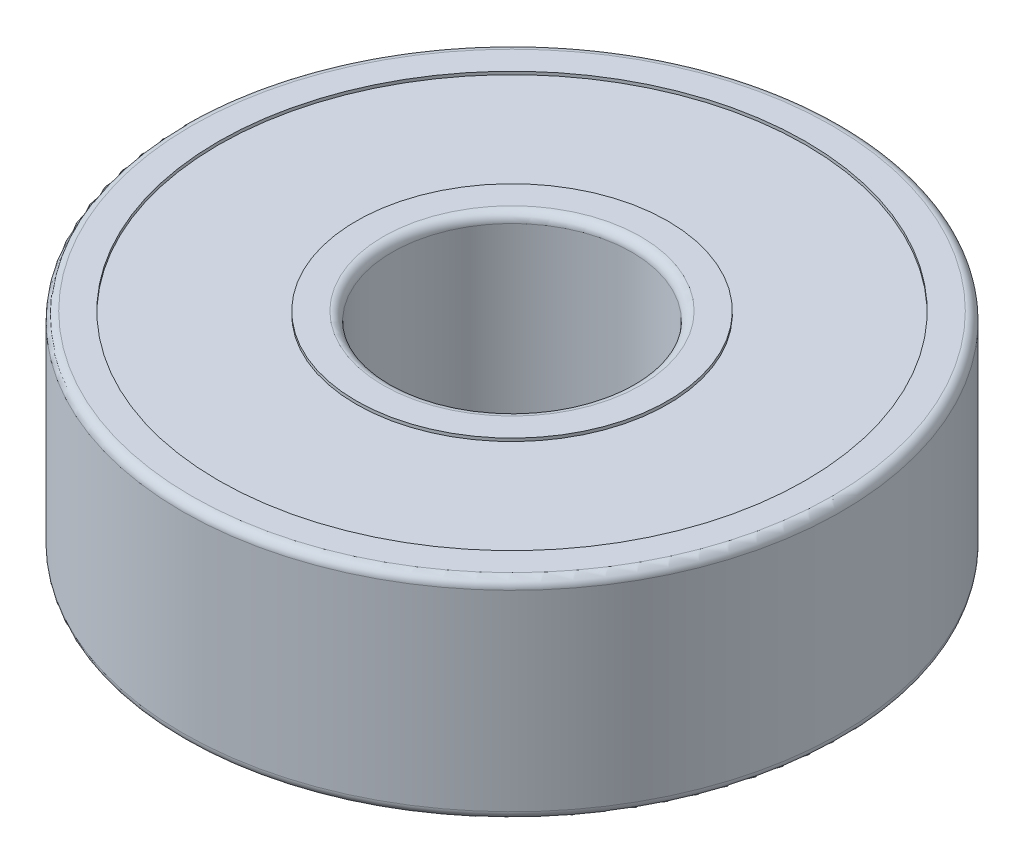
ISO-10303-21;
HEADER;
FILE_DESCRIPTION(('STEP AP214'),'2;1');
FILE_NAME('part.step','',(''),(''),'','','');
FILE_SCHEMA(('AUTOMOTIVE_DESIGN { 1 0 10303 214 1 1 1 1 }'));
ENDSEC;
DATA;
#1=APPLICATION_CONTEXT('core data for automotive mechanical design processes');
#2=APPLICATION_PROTOCOL_DEFINITION('international standard','automotive_design',2000,#1);
#3=PRODUCT_CONTEXT('',#1,'mechanical');
#4=PRODUCT('Part','Part','',(#3));
#5=PRODUCT_RELATED_PRODUCT_CATEGORY('part','',(#4));
#6=PRODUCT_DEFINITION_FORMATION('','',#4);
#7=PRODUCT_DEFINITION_CONTEXT('part definition',#1,'design');
#8=PRODUCT_DEFINITION('design','',#6,#7);
#9=PRODUCT_DEFINITION_SHAPE('','',#8);
#10=(LENGTH_UNIT() NAMED_UNIT(*) SI_UNIT(.MILLI.,.METRE.));
#11=(NAMED_UNIT(*) PLANE_ANGLE_UNIT() SI_UNIT($,.RADIAN.));
#12=(NAMED_UNIT(*) SI_UNIT($,.STERADIAN.) SOLID_ANGLE_UNIT());
#13=UNCERTAINTY_MEASURE_WITH_UNIT(LENGTH_MEASURE(1.E-05),#10,'distance_accuracy_value','');
#14=(GEOMETRIC_REPRESENTATION_CONTEXT(3) GLOBAL_UNCERTAINTY_ASSIGNED_CONTEXT((#13)) GLOBAL_UNIT_ASSIGNED_CONTEXT((#10,
#11,#12)) REPRESENTATION_CONTEXT('',''));
#15=CARTESIAN_POINT('',(0.,0.,0.));
#16=DIRECTION('',(0.,0.,1.));
#17=DIRECTION('',(1.,0.,0.));
#18=AXIS2_PLACEMENT_3D('',#15,#16,#17);
#19=CARTESIAN_POINT('',(0.,0.,0.));
#20=DIRECTION('',(0.,1.,0.));
#21=DIRECTION('',(0.,0.,1.));
#22=AXIS2_PLACEMENT_3D('',#19,#20,#21);
#23=PLANE('',#22);
#24=CARTESIAN_POINT('',(0.,0.,0.));
#25=DIRECTION('',(0.,1.,0.));
#26=DIRECTION('',(0.,0.,1.));
#27=AXIS2_PLACEMENT_3D('',#24,#25,#26);
#28=CIRCLE('',#27,4.3);
#29=CARTESIAN_POINT('',(0.,0.,4.3));
#30=VERTEX_POINT('',#29);
#31=EDGE_CURVE('E57',#30,#30,#28,.T.);
#32=ORIENTED_EDGE('',*,*,#31,.T.);
#33=EDGE_LOOP('',(#32));
#34=FACE_BOUND('',#33,.T.);
#35=CARTESIAN_POINT('',(0.,0.,0.));
#36=DIRECTION('',(0.,1.,0.));
#37=DIRECTION('',(0.,0.,1.));
#38=AXIS2_PLACEMENT_3D('',#35,#36,#37);
#39=CIRCLE('',#38,5.2);
#40=CARTESIAN_POINT('',(0.,0.,5.2));
#41=VERTEX_POINT('',#40);
#42=EDGE_CURVE('E88',#41,#41,#39,.T.);
#43=ORIENTED_EDGE('',*,*,#42,.F.);
#44=EDGE_LOOP('',(#43));
#45=FACE_BOUND('',#44,.T.);
#46=ADVANCED_FACE('F37',(#34,#45),#23,.F.);
#47=CARTESIAN_POINT('',(0.,7.,0.));
#48=DIRECTION('',(0.,1.,0.));
#49=DIRECTION('',(0.,0.,1.));
#50=AXIS2_PLACEMENT_3D('',#47,#48,#49);
#51=PLANE('',#50);
#52=CARTESIAN_POINT('',(0.,7.,0.));
#53=DIRECTION('',(0.,1.,0.));
#54=DIRECTION('',(0.,0.,1.));
#55=AXIS2_PLACEMENT_3D('',#52,#53,#54);
#56=CIRCLE('',#55,4.3);
#57=CARTESIAN_POINT('',(0.,7.,4.3));
#58=VERTEX_POINT('',#57);
#59=EDGE_CURVE('E60',#58,#58,#56,.F.);
#60=ORIENTED_EDGE('',*,*,#59,.T.);
#61=EDGE_LOOP('',(#60));
#62=FACE_BOUND('',#61,.T.);
#63=CARTESIAN_POINT('',(0.,7.,0.));
#64=DIRECTION('',(0.,1.,0.));
#65=DIRECTION('',(0.,0.,1.));
#66=AXIS2_PLACEMENT_3D('',#63,#64,#65);
#67=CIRCLE('',#66,5.2);
#68=CARTESIAN_POINT('',(0.,7.,5.2));
#69=VERTEX_POINT('',#68);
#70=EDGE_CURVE('E76',#69,#69,#67,.T.);
#71=ORIENTED_EDGE('',*,*,#70,.T.);
#72=EDGE_LOOP('',(#71));
#73=FACE_BOUND('',#72,.T.);
#74=ADVANCED_FACE('F105',(#62,#73),#51,.T.);
#75=CARTESIAN_POINT('',(0.,7.,0.));
#76=DIRECTION('',(0.,1.,0.));
#77=DIRECTION('',(0.,0.,1.));
#78=AXIS2_PLACEMENT_3D('',#75,#76,#77);
#79=CIRCLE('',#78,10.7);
#80=CARTESIAN_POINT('',(0.,7.,10.7));
#81=VERTEX_POINT('',#80);
#82=EDGE_CURVE('E10',#81,#81,#79,.T.);
#83=ORIENTED_EDGE('',*,*,#82,.T.);
#84=EDGE_LOOP('',(#83));
#85=FACE_BOUND('',#84,.T.);
#86=CARTESIAN_POINT('',(0.,7.,0.));
#87=DIRECTION('',(0.,1.,0.));
#88=DIRECTION('',(0.,0.,1.));
#89=AXIS2_PLACEMENT_3D('',#86,#87,#88);
#90=CIRCLE('',#89,9.8);
#91=CARTESIAN_POINT('',(0.,7.,9.8));
#92=VERTEX_POINT('',#91);
#93=EDGE_CURVE('E70',#92,#92,#90,.T.);
#94=ORIENTED_EDGE('',*,*,#93,.F.);
#95=EDGE_LOOP('',(#94));
#96=FACE_BOUND('',#95,.T.);
#97=ADVANCED_FACE('F112',(#85,#96),#51,.T.);
#98=CARTESIAN_POINT('',(0.,0.,0.));
#99=DIRECTION('',(0.,1.,0.));
#100=DIRECTION('',(0.,0.,1.));
#101=AXIS2_PLACEMENT_3D('',#98,#99,#100);
#102=CIRCLE('',#101,10.7);
#103=CARTESIAN_POINT('',(0.,0.,10.7));
#104=VERTEX_POINT('',#103);
#105=EDGE_CURVE('E44',#104,#104,#102,.F.);
#106=ORIENTED_EDGE('',*,*,#105,.T.);
#107=EDGE_LOOP('',(#106));
#108=FACE_BOUND('',#107,.T.);
#109=CARTESIAN_POINT('',(0.,0.,0.));
#110=DIRECTION('',(0.,1.,0.));
#111=DIRECTION('',(0.,0.,1.));
#112=AXIS2_PLACEMENT_3D('',#109,#110,#111);
#113=CIRCLE('',#112,9.8);
#114=CARTESIAN_POINT('',(0.,0.,9.8));
#115=VERTEX_POINT('',#114);
#116=EDGE_CURVE('E82',#115,#115,#113,.T.);
#117=ORIENTED_EDGE('',*,*,#116,.T.);
#118=EDGE_LOOP('',(#117));
#119=FACE_BOUND('',#118,.T.);
#120=ADVANCED_FACE('F108',(#108,#119),#23,.F.);
#121=CARTESIAN_POINT('',(0.,7.,0.));
#122=DIRECTION('',(0.,-1.,0.));
#123=DIRECTION('',(0.,0.,-1.));
#124=AXIS2_PLACEMENT_3D('',#121,#122,#123);
#125=CYLINDRICAL_SURFACE('',#124,11.);
#126=CARTESIAN_POINT('',(0.,0.3,0.));
#127=DIRECTION('',(0.,1.,0.));
#128=DIRECTION('',(0.,0.,1.));
#129=AXIS2_PLACEMENT_3D('',#126,#127,#128);
#130=CIRCLE('',#129,11.);
#131=CARTESIAN_POINT('',(0.,0.3,11.));
#132=VERTEX_POINT('',#131);
#133=EDGE_CURVE('E48',#132,#132,#130,.T.);
#134=ORIENTED_EDGE('',*,*,#133,.T.);
#135=EDGE_LOOP('',(#134));
#136=FACE_BOUND('',#135,.T.);
#137=CARTESIAN_POINT('',(0.,6.7,0.));
#138=DIRECTION('',(0.,1.,0.));
#139=DIRECTION('',(0.,0.,1.));
#140=AXIS2_PLACEMENT_3D('',#137,#138,#139);
#141=CIRCLE('',#140,11.);
#142=CARTESIAN_POINT('',(0.,6.7,11.));
#143=VERTEX_POINT('',#142);
#144=EDGE_CURVE('E52',#143,#143,#141,.F.);
#145=ORIENTED_EDGE('',*,*,#144,.T.);
#146=EDGE_LOOP('',(#145));
#147=FACE_BOUND('',#146,.T.);
#148=ADVANCED_FACE('F117',(#136,#147),#125,.T.);
#149=CARTESIAN_POINT('',(0.,7.,0.));
#150=DIRECTION('',(0.,-1.,0.));
#151=DIRECTION('',(0.,0.,-1.));
#152=AXIS2_PLACEMENT_3D('',#149,#150,#151);
#153=CYLINDRICAL_SURFACE('',#152,4.);
#154=CARTESIAN_POINT('',(0.,6.7,0.));
#155=DIRECTION('',(0.,1.,0.));
#156=DIRECTION('',(0.,0.,1.));
#157=AXIS2_PLACEMENT_3D('',#154,#155,#156);
#158=CIRCLE('',#157,4.);
#159=CARTESIAN_POINT('',(0.,6.7,4.));
#160=VERTEX_POINT('',#159);
#161=EDGE_CURVE('E63',#160,#160,#158,.T.);
#162=ORIENTED_EDGE('',*,*,#161,.T.);
#163=EDGE_LOOP('',(#162));
#164=FACE_BOUND('',#163,.T.);
#165=CARTESIAN_POINT('',(0.,0.3,0.));
#166=DIRECTION('',(0.,1.,0.));
#167=DIRECTION('',(0.,0.,1.));
#168=AXIS2_PLACEMENT_3D('',#165,#166,#167);
#169=CIRCLE('',#168,4.);
#170=CARTESIAN_POINT('',(0.,0.3,4.));
#171=VERTEX_POINT('',#170);
#172=EDGE_CURVE('E66',#171,#171,#169,.F.);
#173=ORIENTED_EDGE('',*,*,#172,.T.);
#174=EDGE_LOOP('',(#173));
#175=FACE_BOUND('',#174,.T.);
#176=ADVANCED_FACE('F122',(#164,#175),#153,.F.);
#177=CARTESIAN_POINT('',(0.,6.9,0.));
#178=DIRECTION('',(0.,1.,0.));
#179=DIRECTION('',(0.,0.,1.));
#180=AXIS2_PLACEMENT_3D('',#177,#178,#179);
#181=CYLINDRICAL_SURFACE('',#180,9.8);
#182=CARTESIAN_POINT('',(0.,6.9,0.));
#183=DIRECTION('',(0.,1.,0.));
#184=DIRECTION('',(0.,0.,1.));
#185=AXIS2_PLACEMENT_3D('',#182,#183,#184);
#186=CIRCLE('',#185,9.8);
#187=CARTESIAN_POINT('',(0.,6.9,9.8));
#188=VERTEX_POINT('',#187);
#189=EDGE_CURVE('E69',#188,#188,#186,.T.);
#190=ORIENTED_EDGE('',*,*,#189,.F.);
#191=EDGE_LOOP('',(#190));
#192=FACE_BOUND('',#191,.T.);
#193=ORIENTED_EDGE('',*,*,#93,.T.);
#194=EDGE_LOOP('',(#193));
#195=FACE_BOUND('',#194,.T.);
#196=ADVANCED_FACE('F143',(#192,#195),#181,.F.);
#197=CARTESIAN_POINT('',(0.,6.9,0.));
#198=DIRECTION('',(0.,1.,0.));
#199=DIRECTION('',(0.,0.,1.));
#200=AXIS2_PLACEMENT_3D('',#197,#198,#199);
#201=PLANE('',#200);
#202=CARTESIAN_POINT('',(0.,6.9,0.));
#203=DIRECTION('',(0.,1.,0.));
#204=DIRECTION('',(0.,0.,1.));
#205=AXIS2_PLACEMENT_3D('',#202,#203,#204);
#206=CIRCLE('',#205,5.2);
#207=CARTESIAN_POINT('',(0.,6.9,5.2));
#208=VERTEX_POINT('',#207);
#209=EDGE_CURVE('E73',#208,#208,#206,.T.);
#210=ORIENTED_EDGE('',*,*,#209,.F.);
#211=EDGE_LOOP('',(#210));
#212=FACE_BOUND('',#211,.T.);
#213=ORIENTED_EDGE('',*,*,#189,.T.);
#214=EDGE_LOOP('',(#213));
#215=FACE_BOUND('',#214,.T.);
#216=ADVANCED_FACE('F139',(#212,#215),#201,.T.);
#217=CARTESIAN_POINT('',(0.,6.9,0.));
#218=DIRECTION('',(0.,1.,0.));
#219=DIRECTION('',(0.,0.,1.));
#220=AXIS2_PLACEMENT_3D('',#217,#218,#219);
#221=CYLINDRICAL_SURFACE('',#220,5.2);
#222=ORIENTED_EDGE('',*,*,#209,.T.);
#223=EDGE_LOOP('',(#222));
#224=FACE_BOUND('',#223,.T.);
#225=ORIENTED_EDGE('',*,*,#70,.F.);
#226=EDGE_LOOP('',(#225));
#227=FACE_BOUND('',#226,.T.);
#228=ADVANCED_FACE('F133',(#224,#227),#221,.T.);
#229=CARTESIAN_POINT('',(0.,0.1,0.));
#230=DIRECTION('',(0.,-1.,0.));
#231=DIRECTION('',(0.,0.,1.));
#232=AXIS2_PLACEMENT_3D('',#229,#230,#231);
#233=PLANE('',#232);
#234=CARTESIAN_POINT('',(0.,0.1,0.));
#235=DIRECTION('',(0.,1.,0.));
#236=DIRECTION('',(0.,0.,1.));
#237=AXIS2_PLACEMENT_3D('',#234,#235,#236);
#238=CIRCLE('',#237,9.8);
#239=CARTESIAN_POINT('',(0.,0.1,9.8));
#240=VERTEX_POINT('',#239);
#241=EDGE_CURVE('E79',#240,#240,#238,.T.);
#242=ORIENTED_EDGE('',*,*,#241,.F.);
#243=EDGE_LOOP('',(#242));
#244=FACE_BOUND('',#243,.T.);
#245=CARTESIAN_POINT('',(0.,0.1,0.));
#246=DIRECTION('',(0.,1.,0.));
#247=DIRECTION('',(0.,0.,1.));
#248=AXIS2_PLACEMENT_3D('',#245,#246,#247);
#249=CIRCLE('',#248,5.2);
#250=CARTESIAN_POINT('',(0.,0.1,5.2));
#251=VERTEX_POINT('',#250);
#252=EDGE_CURVE('E85',#251,#251,#249,.T.);
#253=ORIENTED_EDGE('',*,*,#252,.T.);
#254=EDGE_LOOP('',(#253));
#255=FACE_BOUND('',#254,.T.);
#256=ADVANCED_FACE('F94',(#244,#255),#233,.T.);
#257=CARTESIAN_POINT('',(0.,0.1,0.));
#258=DIRECTION('',(0.,-1.,0.));
#259=DIRECTION('',(0.,0.,-1.));
#260=AXIS2_PLACEMENT_3D('',#257,#258,#259);
#261=CYLINDRICAL_SURFACE('',#260,9.8);
#262=ORIENTED_EDGE('',*,*,#241,.T.);
#263=EDGE_LOOP('',(#262));
#264=FACE_BOUND('',#263,.T.);
#265=ORIENTED_EDGE('',*,*,#116,.F.);
#266=EDGE_LOOP('',(#265));
#267=FACE_BOUND('',#266,.T.);
#268=ADVANCED_FACE('F100',(#264,#267),#261,.F.);
#269=CARTESIAN_POINT('',(0.,0.1,0.));
#270=DIRECTION('',(0.,-1.,0.));
#271=DIRECTION('',(0.,0.,-1.));
#272=AXIS2_PLACEMENT_3D('',#269,#270,#271);
#273=CYLINDRICAL_SURFACE('',#272,5.2);
#274=ORIENTED_EDGE('',*,*,#252,.F.);
#275=EDGE_LOOP('',(#274));
#276=FACE_BOUND('',#275,.T.);
#277=ORIENTED_EDGE('',*,*,#42,.T.);
#278=EDGE_LOOP('',(#277));
#279=FACE_BOUND('',#278,.T.);
#280=ADVANCED_FACE('F96',(#276,#279),#273,.T.);
#281=CARTESIAN_POINT('',(0.,6.7,0.));
#282=DIRECTION('',(0.,1.,0.));
#283=DIRECTION('',(0.,0.,1.));
#284=AXIS2_PLACEMENT_3D('',#281,#282,#283);
#285=TOROIDAL_SURFACE('',#284,4.3,0.3);
#286=ORIENTED_EDGE('',*,*,#59,.F.);
#287=EDGE_LOOP('',(#286));
#288=FACE_BOUND('',#287,.T.);
#289=ORIENTED_EDGE('',*,*,#161,.F.);
#290=EDGE_LOOP('',(#289));
#291=FACE_BOUND('',#290,.T.);
#292=ADVANCED_FACE('F99',(#288,#291),#285,.T.);
#293=CARTESIAN_POINT('',(0.,0.3,0.));
#294=DIRECTION('',(0.,1.,0.));
#295=DIRECTION('',(0.,0.,1.));
#296=AXIS2_PLACEMENT_3D('',#293,#294,#295);
#297=TOROIDAL_SURFACE('',#296,4.3,0.3);
#298=ORIENTED_EDGE('',*,*,#172,.F.);
#299=EDGE_LOOP('',(#298));
#300=FACE_BOUND('',#299,.T.);
#301=ORIENTED_EDGE('',*,*,#31,.F.);
#302=EDGE_LOOP('',(#301));
#303=FACE_BOUND('',#302,.T.);
#304=ADVANCED_FACE('F156',(#300,#303),#297,.T.);
#305=CARTESIAN_POINT('',(0.,0.3,0.));
#306=DIRECTION('',(0.,1.,0.));
#307=DIRECTION('',(0.,0.,1.));
#308=AXIS2_PLACEMENT_3D('',#305,#306,#307);
#309=TOROIDAL_SURFACE('',#308,10.7,0.3);
#310=ORIENTED_EDGE('',*,*,#105,.F.);
#311=EDGE_LOOP('',(#310));
#312=FACE_BOUND('',#311,.T.);
#313=ORIENTED_EDGE('',*,*,#133,.F.);
#314=EDGE_LOOP('',(#313));
#315=FACE_BOUND('',#314,.T.);
#316=ADVANCED_FACE('F159',(#312,#315),#309,.T.);
#317=CARTESIAN_POINT('',(0.,6.7,0.));
#318=DIRECTION('',(0.,1.,0.));
#319=DIRECTION('',(0.,0.,1.));
#320=AXIS2_PLACEMENT_3D('',#317,#318,#319);
#321=TOROIDAL_SURFACE('',#320,10.7,0.3);
#322=ORIENTED_EDGE('',*,*,#144,.F.);
#323=EDGE_LOOP('',(#322));
#324=FACE_BOUND('',#323,.T.);
#325=ORIENTED_EDGE('',*,*,#82,.F.);
#326=EDGE_LOOP('',(#325));
#327=FACE_BOUND('',#326,.T.);
#328=ADVANCED_FACE('F39',(#324,#327),#321,.T.);
#329=CLOSED_SHELL('',(#46,#74,#97,#120,#148,#176,#196,#216,#228,#256,#268,#280,#292,#304,#316,#328));
#330=MANIFOLD_SOLID_BREP('B2',#329);
#331=ADVANCED_BREP_SHAPE_REPRESENTATION('',(#18,#330),#14);
#332=SHAPE_DEFINITION_REPRESENTATION(#9,#331);
ENDSEC;
END-ISO-10303-21;
